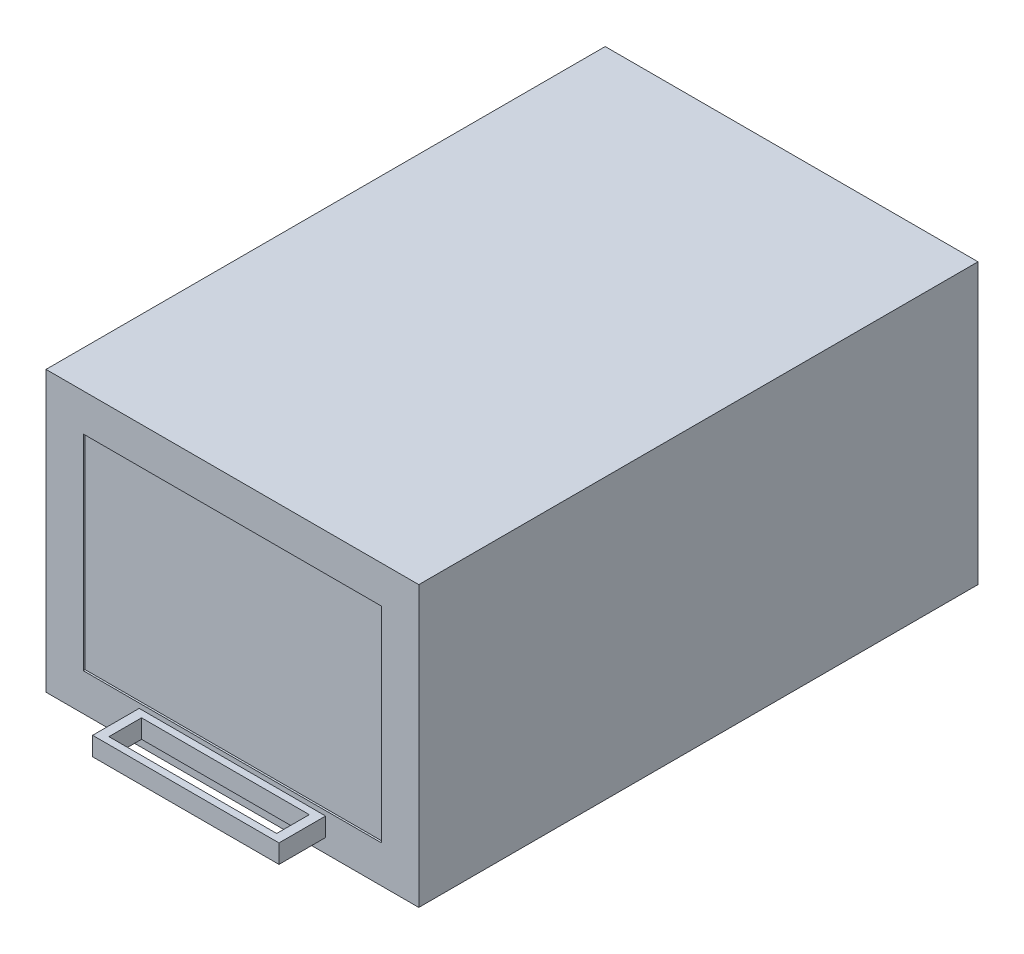
ISO-10303-21;
HEADER;
FILE_DESCRIPTION(('STEP AP214'),'2;1');
FILE_NAME('part.step','',(''),(''),'','','');
FILE_SCHEMA(('AUTOMOTIVE_DESIGN { 1 0 10303 214 1 1 1 1 }'));
ENDSEC;
DATA;
#1=APPLICATION_CONTEXT('core data for automotive mechanical design processes');
#2=APPLICATION_PROTOCOL_DEFINITION('international standard','automotive_design',2000,#1);
#3=PRODUCT_CONTEXT('',#1,'mechanical');
#4=PRODUCT('Part','Part','',(#3));
#5=PRODUCT_RELATED_PRODUCT_CATEGORY('part','',(#4));
#6=PRODUCT_DEFINITION_FORMATION('','',#4);
#7=PRODUCT_DEFINITION_CONTEXT('part definition',#1,'design');
#8=PRODUCT_DEFINITION('design','',#6,#7);
#9=PRODUCT_DEFINITION_SHAPE('','',#8);
#10=(LENGTH_UNIT() NAMED_UNIT(*) SI_UNIT(.MILLI.,.METRE.));
#11=(NAMED_UNIT(*) PLANE_ANGLE_UNIT() SI_UNIT($,.RADIAN.));
#12=(NAMED_UNIT(*) SI_UNIT($,.STERADIAN.) SOLID_ANGLE_UNIT());
#13=UNCERTAINTY_MEASURE_WITH_UNIT(LENGTH_MEASURE(1.E-05),#10,'distance_accuracy_value','');
#14=(GEOMETRIC_REPRESENTATION_CONTEXT(3) GLOBAL_UNCERTAINTY_ASSIGNED_CONTEXT((#13)) GLOBAL_UNIT_ASSIGNED_CONTEXT((#10,
#11,#12)) REPRESENTATION_CONTEXT('',''));
#15=CARTESIAN_POINT('',(0.,0.,0.));
#16=DIRECTION('',(0.,0.,1.));
#17=DIRECTION('',(1.,0.,0.));
#18=AXIS2_PLACEMENT_3D('',#15,#16,#17);
#19=CARTESIAN_POINT('',(0.,300.,600.));
#20=DIRECTION('',(0.,0.,-1.));
#21=DIRECTION('',(-1.,0.,0.));
#22=AXIS2_PLACEMENT_3D('',#19,#20,#21);
#23=PLANE('',#22);
#24=DIRECTION('',(1.,0.,0.));
#25=VECTOR('',#24,1.);
#26=CARTESIAN_POINT('',(-360.,40.,600.));
#27=LINE('',#26,#25);
#28=CARTESIAN_POINT('',(-360.,40.,600.));
#29=VERTEX_POINT('',#28);
#30=CARTESIAN_POINT('',(-40.0000000000001,40.,600.));
#31=VERTEX_POINT('',#30);
#32=EDGE_CURVE('E191',#29,#31,#27,.T.);
#33=ORIENTED_EDGE('',*,*,#32,.F.);
#34=DIRECTION('',(0.,-1.,0.));
#35=VECTOR('',#34,1.);
#36=CARTESIAN_POINT('',(-360.,260.,600.));
#37=LINE('',#36,#35);
#38=CARTESIAN_POINT('',(-360.,260.,600.));
#39=VERTEX_POINT('',#38);
#40=EDGE_CURVE('E57',#39,#29,#37,.T.);
#41=ORIENTED_EDGE('',*,*,#40,.F.);
#42=DIRECTION('',(-1.,0.,0.));
#43=VECTOR('',#42,1.);
#44=CARTESIAN_POINT('',(-360.,260.,600.));
#45=LINE('',#44,#43);
#46=CARTESIAN_POINT('',(-40.0000000000001,260.,600.));
#47=VERTEX_POINT('',#46);
#48=EDGE_CURVE('E178',#47,#39,#45,.T.);
#49=ORIENTED_EDGE('',*,*,#48,.F.);
#50=DIRECTION('',(0.,1.,0.));
#51=VECTOR('',#50,1.);
#52=CARTESIAN_POINT('',(-40.0000000000001,260.,600.));
#53=LINE('',#52,#51);
#54=EDGE_CURVE('E182',#31,#47,#53,.T.);
#55=ORIENTED_EDGE('',*,*,#54,.F.);
#56=EDGE_LOOP('',(#33,#41,#49,#55));
#57=FACE_BOUND('',#56,.T.);
#58=DIRECTION('',(1.,0.,0.));
#59=VECTOR('',#58,1.);
#60=CARTESIAN_POINT('',(0.,0.,600.));
#61=LINE('',#60,#59);
#62=CARTESIAN_POINT('',(-400.,0.,600.));
#63=VERTEX_POINT('',#62);
#64=CARTESIAN_POINT('',(0.,0.,600.));
#65=VERTEX_POINT('',#64);
#66=EDGE_CURVE('E298',#63,#65,#61,.T.);
#67=ORIENTED_EDGE('',*,*,#66,.T.);
#68=DIRECTION('',(0.,-1.,0.));
#69=VECTOR('',#68,1.);
#70=CARTESIAN_POINT('',(0.,300.,600.));
#71=LINE('',#70,#69);
#72=CARTESIAN_POINT('',(0.,300.,600.));
#73=VERTEX_POINT('',#72);
#74=EDGE_CURVE('E307',#73,#65,#71,.T.);
#75=ORIENTED_EDGE('',*,*,#74,.F.);
#76=DIRECTION('',(1.,0.,0.));
#77=VECTOR('',#76,1.);
#78=CARTESIAN_POINT('',(0.,300.,600.));
#79=LINE('',#78,#77);
#80=CARTESIAN_POINT('',(-400.,300.,600.));
#81=VERTEX_POINT('',#80);
#82=EDGE_CURVE('E304',#81,#73,#79,.T.);
#83=ORIENTED_EDGE('',*,*,#82,.F.);
#84=DIRECTION('',(0.,-1.,0.));
#85=VECTOR('',#84,1.);
#86=CARTESIAN_POINT('',(-400.,300.,600.));
#87=LINE('',#86,#85);
#88=EDGE_CURVE('E322',#81,#63,#87,.T.);
#89=ORIENTED_EDGE('',*,*,#88,.T.);
#90=EDGE_LOOP('',(#67,#75,#83,#89));
#91=FACE_BOUND('',#90,.T.);
#92=DIRECTION('',(0.,-1.,0.));
#93=VECTOR('',#92,1.);
#94=CARTESIAN_POINT('',(-300.,35.,600.));
#95=LINE('',#94,#93);
#96=CARTESIAN_POINT('',(-300.,35.,600.));
#97=VERTEX_POINT('',#96);
#98=CARTESIAN_POINT('',(-300.,15.,600.));
#99=VERTEX_POINT('',#98);
#100=EDGE_CURVE('E247',#97,#99,#95,.T.);
#101=ORIENTED_EDGE('',*,*,#100,.F.);
#102=DIRECTION('',(-1.,0.,0.));
#103=VECTOR('',#102,1.);
#104=CARTESIAN_POINT('',(-300.,35.,600.));
#105=LINE('',#104,#103);
#106=CARTESIAN_POINT('',(-99.9999999999999,35.,600.));
#107=VERTEX_POINT('',#106);
#108=EDGE_CURVE('E253',#107,#97,#105,.T.);
#109=ORIENTED_EDGE('',*,*,#108,.F.);
#110=DIRECTION('',(0.,1.,0.));
#111=VECTOR('',#110,1.);
#112=CARTESIAN_POINT('',(-99.9999999999999,35.,600.));
#113=LINE('',#112,#111);
#114=CARTESIAN_POINT('',(-99.9999999999999,15.,600.));
#115=VERTEX_POINT('',#114);
#116=EDGE_CURVE('E270',#115,#107,#113,.T.);
#117=ORIENTED_EDGE('',*,*,#116,.F.);
#118=DIRECTION('',(1.,0.,0.));
#119=VECTOR('',#118,1.);
#120=CARTESIAN_POINT('',(-300.,15.,600.));
#121=LINE('',#120,#119);
#122=EDGE_CURVE('E266',#99,#115,#121,.T.);
#123=ORIENTED_EDGE('',*,*,#122,.F.);
#124=EDGE_LOOP('',(#101,#109,#117,#123));
#125=FACE_BOUND('',#124,.T.);
#126=ADVANCED_FACE('F41',(#57,#91,#125),#23,.F.);
#127=CARTESIAN_POINT('',(0.,300.,0.));
#128=DIRECTION('',(-1.,0.,0.));
#129=DIRECTION('',(0.,0.,1.));
#130=AXIS2_PLACEMENT_3D('',#127,#128,#129);
#131=PLANE('',#130);
#132=DIRECTION('',(0.,0.,-1.));
#133=VECTOR('',#132,1.);
#134=CARTESIAN_POINT('',(0.,0.,0.));
#135=LINE('',#134,#133);
#136=CARTESIAN_POINT('',(0.,0.,0.));
#137=VERTEX_POINT('',#136);
#138=EDGE_CURVE('E292',#65,#137,#135,.T.);
#139=ORIENTED_EDGE('',*,*,#138,.T.);
#140=DIRECTION('',(0.,-1.,0.));
#141=VECTOR('',#140,1.);
#142=CARTESIAN_POINT('',(0.,300.,0.));
#143=LINE('',#142,#141);
#144=CARTESIAN_POINT('',(0.,300.,0.));
#145=VERTEX_POINT('',#144);
#146=EDGE_CURVE('E11',#145,#137,#143,.T.);
#147=ORIENTED_EDGE('',*,*,#146,.F.);
#148=DIRECTION('',(0.,0.,-1.));
#149=VECTOR('',#148,1.);
#150=CARTESIAN_POINT('',(0.,300.,0.));
#151=LINE('',#150,#149);
#152=EDGE_CURVE('E293',#73,#145,#151,.T.);
#153=ORIENTED_EDGE('',*,*,#152,.F.);
#154=ORIENTED_EDGE('',*,*,#74,.T.);
#155=EDGE_LOOP('',(#139,#147,#153,#154));
#156=FACE_BOUND('',#155,.T.);
#157=ADVANCED_FACE('F43',(#156),#131,.F.);
#158=CARTESIAN_POINT('',(0.,300.,0.));
#159=DIRECTION('',(0.,0.,1.));
#160=DIRECTION('',(1.,0.,0.));
#161=AXIS2_PLACEMENT_3D('',#158,#159,#160);
#162=PLANE('',#161);
#163=DIRECTION('',(-1.,0.,0.));
#164=VECTOR('',#163,1.);
#165=CARTESIAN_POINT('',(0.,0.,0.));
#166=LINE('',#165,#164);
#167=CARTESIAN_POINT('',(-400.,0.,0.));
#168=VERTEX_POINT('',#167);
#169=EDGE_CURVE('E311',#137,#168,#166,.T.);
#170=ORIENTED_EDGE('',*,*,#169,.T.);
#171=DIRECTION('',(0.,-1.,0.));
#172=VECTOR('',#171,1.);
#173=CARTESIAN_POINT('',(-400.,300.,0.));
#174=LINE('',#173,#172);
#175=CARTESIAN_POINT('',(-400.,300.,0.));
#176=VERTEX_POINT('',#175);
#177=EDGE_CURVE('E50',#176,#168,#174,.T.);
#178=ORIENTED_EDGE('',*,*,#177,.F.);
#179=DIRECTION('',(-1.,0.,0.));
#180=VECTOR('',#179,1.);
#181=CARTESIAN_POINT('',(0.,300.,0.));
#182=LINE('',#181,#180);
#183=EDGE_CURVE('E297',#145,#176,#182,.T.);
#184=ORIENTED_EDGE('',*,*,#183,.F.);
#185=ORIENTED_EDGE('',*,*,#146,.T.);
#186=EDGE_LOOP('',(#170,#178,#184,#185));
#187=FACE_BOUND('',#186,.T.);
#188=ADVANCED_FACE('F347',(#187),#162,.F.);
#189=CARTESIAN_POINT('',(-400.,300.,0.));
#190=DIRECTION('',(1.,0.,0.));
#191=DIRECTION('',(0.,0.,-1.));
#192=AXIS2_PLACEMENT_3D('',#189,#190,#191);
#193=PLANE('',#192);
#194=DIRECTION('',(0.,0.,1.));
#195=VECTOR('',#194,1.);
#196=CARTESIAN_POINT('',(-400.,0.,0.));
#197=LINE('',#196,#195);
#198=EDGE_CURVE('E314',#168,#63,#197,.T.);
#199=ORIENTED_EDGE('',*,*,#198,.T.);
#200=ORIENTED_EDGE('',*,*,#88,.F.);
#201=DIRECTION('',(0.,0.,1.));
#202=VECTOR('',#201,1.);
#203=CARTESIAN_POINT('',(-400.,300.,0.));
#204=LINE('',#203,#202);
#205=EDGE_CURVE('E301',#176,#81,#204,.T.);
#206=ORIENTED_EDGE('',*,*,#205,.F.);
#207=ORIENTED_EDGE('',*,*,#177,.T.);
#208=EDGE_LOOP('',(#199,#200,#206,#207));
#209=FACE_BOUND('',#208,.T.);
#210=ADVANCED_FACE('F331',(#209),#193,.F.);
#211=CARTESIAN_POINT('',(0.,300.,0.));
#212=DIRECTION('',(0.,-1.,0.));
#213=DIRECTION('',(0.,0.,-1.));
#214=AXIS2_PLACEMENT_3D('',#211,#212,#213);
#215=PLANE('',#214);
#216=ORIENTED_EDGE('',*,*,#152,.T.);
#217=ORIENTED_EDGE('',*,*,#183,.T.);
#218=ORIENTED_EDGE('',*,*,#205,.T.);
#219=ORIENTED_EDGE('',*,*,#82,.T.);
#220=EDGE_LOOP('',(#216,#217,#218,#219));
#221=FACE_BOUND('',#220,.T.);
#222=ADVANCED_FACE('F346',(#221),#215,.F.);
#223=CARTESIAN_POINT('',(0.,0.,0.));
#224=DIRECTION('',(0.,-1.,0.));
#225=DIRECTION('',(0.,0.,-1.));
#226=AXIS2_PLACEMENT_3D('',#223,#224,#225);
#227=PLANE('',#226);
#228=ORIENTED_EDGE('',*,*,#138,.F.);
#229=ORIENTED_EDGE('',*,*,#66,.F.);
#230=ORIENTED_EDGE('',*,*,#198,.F.);
#231=ORIENTED_EDGE('',*,*,#169,.F.);
#232=EDGE_LOOP('',(#228,#229,#230,#231));
#233=FACE_BOUND('',#232,.T.);
#234=ADVANCED_FACE('F337',(#233),#227,.T.);
#235=CARTESIAN_POINT('',(-300.,35.,650.));
#236=DIRECTION('',(1.,0.,0.));
#237=DIRECTION('',(0.,0.,-1.));
#238=AXIS2_PLACEMENT_3D('',#235,#236,#237);
#239=PLANE('',#238);
#240=ORIENTED_EDGE('',*,*,#100,.T.);
#241=DIRECTION('',(0.,0.,-1.));
#242=VECTOR('',#241,1.);
#243=CARTESIAN_POINT('',(-300.,15.,650.));
#244=LINE('',#243,#242);
#245=CARTESIAN_POINT('',(-300.,15.,650.));
#246=VERTEX_POINT('',#245);
#247=EDGE_CURVE('E288',#246,#99,#244,.T.);
#248=ORIENTED_EDGE('',*,*,#247,.F.);
#249=DIRECTION('',(0.,-1.,0.));
#250=VECTOR('',#249,1.);
#251=CARTESIAN_POINT('',(-300.,35.,650.));
#252=LINE('',#251,#250);
#253=CARTESIAN_POINT('',(-300.,35.,650.));
#254=VERTEX_POINT('',#253);
#255=EDGE_CURVE('E248',#254,#246,#252,.T.);
#256=ORIENTED_EDGE('',*,*,#255,.F.);
#257=DIRECTION('',(0.,0.,-1.));
#258=VECTOR('',#257,1.);
#259=CARTESIAN_POINT('',(-300.,35.,650.));
#260=LINE('',#259,#258);
#261=EDGE_CURVE('E262',#254,#97,#260,.T.);
#262=ORIENTED_EDGE('',*,*,#261,.T.);
#263=EDGE_LOOP('',(#240,#248,#256,#262));
#264=FACE_BOUND('',#263,.T.);
#265=ADVANCED_FACE('F362',(#264),#239,.F.);
#266=CARTESIAN_POINT('',(-300.,15.,650.));
#267=DIRECTION('',(0.,1.,0.));
#268=DIRECTION('',(0.,0.,1.));
#269=AXIS2_PLACEMENT_3D('',#266,#267,#268);
#270=PLANE('',#269);
#271=DIRECTION('',(-1.,0.,0.));
#272=VECTOR('',#271,1.);
#273=CARTESIAN_POINT('',(-300.,15.,607.5));
#274=LINE('',#273,#272);
#275=CARTESIAN_POINT('',(-110.,15.,607.5));
#276=VERTEX_POINT('',#275);
#277=CARTESIAN_POINT('',(-290.,15.,607.5));
#278=VERTEX_POINT('',#277);
#279=EDGE_CURVE('E239',#276,#278,#274,.T.);
#280=ORIENTED_EDGE('',*,*,#279,.T.);
#281=DIRECTION('',(0.,0.,1.));
#282=VECTOR('',#281,1.);
#283=CARTESIAN_POINT('',(-290.,15.,650.));
#284=LINE('',#283,#282);
#285=CARTESIAN_POINT('',(-290.,15.,642.5));
#286=VERTEX_POINT('',#285);
#287=EDGE_CURVE('E243',#278,#286,#284,.T.);
#288=ORIENTED_EDGE('',*,*,#287,.T.);
#289=DIRECTION('',(1.,0.,0.));
#290=VECTOR('',#289,1.);
#291=CARTESIAN_POINT('',(-300.,15.,642.5));
#292=LINE('',#291,#290);
#293=CARTESIAN_POINT('',(-110.,15.,642.5));
#294=VERTEX_POINT('',#293);
#295=EDGE_CURVE('E223',#286,#294,#292,.T.);
#296=ORIENTED_EDGE('',*,*,#295,.T.);
#297=DIRECTION('',(0.,0.,-1.));
#298=VECTOR('',#297,1.);
#299=CARTESIAN_POINT('',(-110.,15.,650.));
#300=LINE('',#299,#298);
#301=EDGE_CURVE('E235',#294,#276,#300,.T.);
#302=ORIENTED_EDGE('',*,*,#301,.T.);
#303=EDGE_LOOP('',(#280,#288,#296,#302));
#304=FACE_BOUND('',#303,.T.);
#305=ORIENTED_EDGE('',*,*,#122,.T.);
#306=DIRECTION('',(0.,0.,-1.));
#307=VECTOR('',#306,1.);
#308=CARTESIAN_POINT('',(-99.9999999999999,15.,650.));
#309=LINE('',#308,#307);
#310=CARTESIAN_POINT('',(-99.9999999999999,15.,650.));
#311=VERTEX_POINT('',#310);
#312=EDGE_CURVE('E284',#311,#115,#309,.T.);
#313=ORIENTED_EDGE('',*,*,#312,.F.);
#314=DIRECTION('',(1.,0.,0.));
#315=VECTOR('',#314,1.);
#316=CARTESIAN_POINT('',(-300.,15.,650.));
#317=LINE('',#316,#315);
#318=EDGE_CURVE('E252',#246,#311,#317,.T.);
#319=ORIENTED_EDGE('',*,*,#318,.F.);
#320=ORIENTED_EDGE('',*,*,#247,.T.);
#321=EDGE_LOOP('',(#305,#313,#319,#320));
#322=FACE_BOUND('',#321,.T.);
#323=ADVANCED_FACE('F367',(#304,#322),#270,.F.);
#324=CARTESIAN_POINT('',(-99.9999999999999,35.,650.));
#325=DIRECTION('',(-1.,0.,0.));
#326=DIRECTION('',(0.,0.,1.));
#327=AXIS2_PLACEMENT_3D('',#324,#325,#326);
#328=PLANE('',#327);
#329=ORIENTED_EDGE('',*,*,#116,.T.);
#330=DIRECTION('',(0.,0.,-1.));
#331=VECTOR('',#330,1.);
#332=CARTESIAN_POINT('',(-99.9999999999999,35.,650.));
#333=LINE('',#332,#331);
#334=CARTESIAN_POINT('',(-99.9999999999999,35.,650.));
#335=VERTEX_POINT('',#334);
#336=EDGE_CURVE('E280',#335,#107,#333,.T.);
#337=ORIENTED_EDGE('',*,*,#336,.F.);
#338=DIRECTION('',(0.,1.,0.));
#339=VECTOR('',#338,1.);
#340=CARTESIAN_POINT('',(-99.9999999999999,35.,650.));
#341=LINE('',#340,#339);
#342=EDGE_CURVE('E256',#311,#335,#341,.T.);
#343=ORIENTED_EDGE('',*,*,#342,.F.);
#344=ORIENTED_EDGE('',*,*,#312,.T.);
#345=EDGE_LOOP('',(#329,#337,#343,#344));
#346=FACE_BOUND('',#345,.T.);
#347=ADVANCED_FACE('F371',(#346),#328,.F.);
#348=CARTESIAN_POINT('',(-300.,35.,650.));
#349=DIRECTION('',(0.,-1.,0.));
#350=DIRECTION('',(0.,0.,-1.));
#351=AXIS2_PLACEMENT_3D('',#348,#349,#350);
#352=PLANE('',#351);
#353=DIRECTION('',(1.,0.,0.));
#354=VECTOR('',#353,1.);
#355=CARTESIAN_POINT('',(-290.,35.,642.5));
#356=LINE('',#355,#354);
#357=CARTESIAN_POINT('',(-290.,35.,642.5));
#358=VERTEX_POINT('',#357);
#359=CARTESIAN_POINT('',(-110.,35.,642.5));
#360=VERTEX_POINT('',#359);
#361=EDGE_CURVE('E208',#358,#360,#356,.T.);
#362=ORIENTED_EDGE('',*,*,#361,.F.);
#363=DIRECTION('',(0.,0.,1.));
#364=VECTOR('',#363,1.);
#365=CARTESIAN_POINT('',(-290.,35.,607.5));
#366=LINE('',#365,#364);
#367=CARTESIAN_POINT('',(-290.,35.,607.5));
#368=VERTEX_POINT('',#367);
#369=EDGE_CURVE('E200',#368,#358,#366,.T.);
#370=ORIENTED_EDGE('',*,*,#369,.F.);
#371=DIRECTION('',(-1.,0.,0.));
#372=VECTOR('',#371,1.);
#373=CARTESIAN_POINT('',(-290.,35.,607.5));
#374=LINE('',#373,#372);
#375=CARTESIAN_POINT('',(-110.,35.,607.5));
#376=VERTEX_POINT('',#375);
#377=EDGE_CURVE('E215',#376,#368,#374,.T.);
#378=ORIENTED_EDGE('',*,*,#377,.F.);
#379=DIRECTION('',(0.,0.,-1.));
#380=VECTOR('',#379,1.);
#381=CARTESIAN_POINT('',(-110.,35.,607.5));
#382=LINE('',#381,#380);
#383=EDGE_CURVE('E211',#360,#376,#382,.T.);
#384=ORIENTED_EDGE('',*,*,#383,.F.);
#385=EDGE_LOOP('',(#362,#370,#378,#384));
#386=FACE_BOUND('',#385,.T.);
#387=ORIENTED_EDGE('',*,*,#108,.T.);
#388=ORIENTED_EDGE('',*,*,#261,.F.);
#389=DIRECTION('',(-1.,0.,0.));
#390=VECTOR('',#389,1.);
#391=CARTESIAN_POINT('',(-300.,35.,650.));
#392=LINE('',#391,#390);
#393=EDGE_CURVE('E259',#335,#254,#392,.T.);
#394=ORIENTED_EDGE('',*,*,#393,.F.);
#395=ORIENTED_EDGE('',*,*,#336,.T.);
#396=EDGE_LOOP('',(#387,#388,#394,#395));
#397=FACE_BOUND('',#396,.T.);
#398=ADVANCED_FACE('F375',(#386,#397),#352,.F.);
#399=CARTESIAN_POINT('',(0.,0.,650.));
#400=DIRECTION('',(0.,0.,1.));
#401=DIRECTION('',(1.,0.,0.));
#402=AXIS2_PLACEMENT_3D('',#399,#400,#401);
#403=PLANE('',#402);
#404=ORIENTED_EDGE('',*,*,#255,.T.);
#405=ORIENTED_EDGE('',*,*,#318,.T.);
#406=ORIENTED_EDGE('',*,*,#342,.T.);
#407=ORIENTED_EDGE('',*,*,#393,.T.);
#408=EDGE_LOOP('',(#404,#405,#406,#407));
#409=FACE_BOUND('',#408,.T.);
#410=ADVANCED_FACE('F379',(#409),#403,.T.);
#411=CARTESIAN_POINT('',(-290.,-15.,607.5));
#412=DIRECTION('',(-1.,0.,0.));
#413=DIRECTION('',(0.,0.,1.));
#414=AXIS2_PLACEMENT_3D('',#411,#412,#413);
#415=PLANE('',#414);
#416=DIRECTION('',(0.,1.,0.));
#417=VECTOR('',#416,1.);
#418=CARTESIAN_POINT('',(-290.,-15.,607.5));
#419=LINE('',#418,#417);
#420=EDGE_CURVE('E220',#278,#368,#419,.T.);
#421=ORIENTED_EDGE('',*,*,#420,.T.);
#422=ORIENTED_EDGE('',*,*,#369,.T.);
#423=DIRECTION('',(0.,1.,0.));
#424=VECTOR('',#423,1.);
#425=CARTESIAN_POINT('',(-290.,-15.,642.5));
#426=LINE('',#425,#424);
#427=EDGE_CURVE('E219',#286,#358,#426,.T.);
#428=ORIENTED_EDGE('',*,*,#427,.F.);
#429=ORIENTED_EDGE('',*,*,#287,.F.);
#430=EDGE_LOOP('',(#421,#422,#428,#429));
#431=FACE_BOUND('',#430,.T.);
#432=ADVANCED_FACE('F383',(#431),#415,.F.);
#433=CARTESIAN_POINT('',(-290.,-15.,607.5));
#434=DIRECTION('',(0.,0.,-1.));
#435=DIRECTION('',(-1.,0.,0.));
#436=AXIS2_PLACEMENT_3D('',#433,#434,#435);
#437=PLANE('',#436);
#438=DIRECTION('',(0.,1.,0.));
#439=VECTOR('',#438,1.);
#440=CARTESIAN_POINT('',(-110.,-15.,607.5));
#441=LINE('',#440,#439);
#442=EDGE_CURVE('E224',#276,#376,#441,.T.);
#443=ORIENTED_EDGE('',*,*,#442,.T.);
#444=ORIENTED_EDGE('',*,*,#377,.T.);
#445=ORIENTED_EDGE('',*,*,#420,.F.);
#446=ORIENTED_EDGE('',*,*,#279,.F.);
#447=EDGE_LOOP('',(#443,#444,#445,#446));
#448=FACE_BOUND('',#447,.T.);
#449=ADVANCED_FACE('F387',(#448),#437,.F.);
#450=CARTESIAN_POINT('',(-110.,-15.,607.5));
#451=DIRECTION('',(1.,0.,0.));
#452=DIRECTION('',(0.,0.,-1.));
#453=AXIS2_PLACEMENT_3D('',#450,#451,#452);
#454=PLANE('',#453);
#455=DIRECTION('',(0.,1.,0.));
#456=VECTOR('',#455,1.);
#457=CARTESIAN_POINT('',(-110.,-15.,642.5));
#458=LINE('',#457,#456);
#459=EDGE_CURVE('E65',#294,#360,#458,.T.);
#460=ORIENTED_EDGE('',*,*,#459,.T.);
#461=ORIENTED_EDGE('',*,*,#383,.T.);
#462=ORIENTED_EDGE('',*,*,#442,.F.);
#463=ORIENTED_EDGE('',*,*,#301,.F.);
#464=EDGE_LOOP('',(#460,#461,#462,#463));
#465=FACE_BOUND('',#464,.T.);
#466=ADVANCED_FACE('F392',(#465),#454,.F.);
#467=CARTESIAN_POINT('',(-290.,-15.,642.5));
#468=DIRECTION('',(0.,0.,1.));
#469=DIRECTION('',(1.,0.,0.));
#470=AXIS2_PLACEMENT_3D('',#467,#468,#469);
#471=PLANE('',#470);
#472=ORIENTED_EDGE('',*,*,#427,.T.);
#473=ORIENTED_EDGE('',*,*,#361,.T.);
#474=ORIENTED_EDGE('',*,*,#459,.F.);
#475=ORIENTED_EDGE('',*,*,#295,.F.);
#476=EDGE_LOOP('',(#472,#473,#474,#475));
#477=FACE_BOUND('',#476,.T.);
#478=ADVANCED_FACE('F389',(#477),#471,.F.);
#479=CARTESIAN_POINT('',(-360.,260.,598.));
#480=DIRECTION('',(-1.,0.,0.));
#481=DIRECTION('',(0.,0.,1.));
#482=AXIS2_PLACEMENT_3D('',#479,#480,#481);
#483=PLANE('',#482);
#484=ORIENTED_EDGE('',*,*,#40,.T.);
#485=DIRECTION('',(0.,0.,1.));
#486=VECTOR('',#485,1.);
#487=CARTESIAN_POINT('',(-360.,40.,598.));
#488=LINE('',#487,#486);
#489=CARTESIAN_POINT('',(-360.,40.,598.));
#490=VERTEX_POINT('',#489);
#491=EDGE_CURVE('E153',#490,#29,#488,.T.);
#492=ORIENTED_EDGE('',*,*,#491,.F.);
#493=DIRECTION('',(0.,-1.,0.));
#494=VECTOR('',#493,1.);
#495=CARTESIAN_POINT('',(-360.,260.,598.));
#496=LINE('',#495,#494);
#497=CARTESIAN_POINT('',(-360.,260.,598.));
#498=VERTEX_POINT('',#497);
#499=EDGE_CURVE('E157',#498,#490,#496,.T.);
#500=ORIENTED_EDGE('',*,*,#499,.F.);
#501=DIRECTION('',(0.,0.,1.));
#502=VECTOR('',#501,1.);
#503=CARTESIAN_POINT('',(-360.,260.,598.));
#504=LINE('',#503,#502);
#505=EDGE_CURVE('E197',#498,#39,#504,.T.);
#506=ORIENTED_EDGE('',*,*,#505,.T.);
#507=EDGE_LOOP('',(#484,#492,#500,#506));
#508=FACE_BOUND('',#507,.T.);
#509=ADVANCED_FACE('F155',(#508),#483,.F.);
#510=CARTESIAN_POINT('',(-360.,260.,598.));
#511=DIRECTION('',(0.,1.,0.));
#512=DIRECTION('',(0.,0.,1.));
#513=AXIS2_PLACEMENT_3D('',#510,#511,#512);
#514=PLANE('',#513);
#515=ORIENTED_EDGE('',*,*,#48,.T.);
#516=ORIENTED_EDGE('',*,*,#505,.F.);
#517=DIRECTION('',(-1.,0.,0.));
#518=VECTOR('',#517,1.);
#519=CARTESIAN_POINT('',(-360.,260.,598.));
#520=LINE('',#519,#518);
#521=CARTESIAN_POINT('',(-40.0000000000001,260.,598.));
#522=VERTEX_POINT('',#521);
#523=EDGE_CURVE('E164',#522,#498,#520,.T.);
#524=ORIENTED_EDGE('',*,*,#523,.F.);
#525=DIRECTION('',(0.,0.,1.));
#526=VECTOR('',#525,1.);
#527=CARTESIAN_POINT('',(-40.0000000000001,260.,598.));
#528=LINE('',#527,#526);
#529=EDGE_CURVE('E201',#522,#47,#528,.T.);
#530=ORIENTED_EDGE('',*,*,#529,.T.);
#531=EDGE_LOOP('',(#515,#516,#524,#530));
#532=FACE_BOUND('',#531,.T.);
#533=ADVANCED_FACE('F401',(#532),#514,.F.);
#534=CARTESIAN_POINT('',(-40.0000000000001,260.,598.));
#535=DIRECTION('',(1.,0.,0.));
#536=DIRECTION('',(0.,0.,-1.));
#537=AXIS2_PLACEMENT_3D('',#534,#535,#536);
#538=PLANE('',#537);
#539=ORIENTED_EDGE('',*,*,#54,.T.);
#540=ORIENTED_EDGE('',*,*,#529,.F.);
#541=DIRECTION('',(0.,1.,0.));
#542=VECTOR('',#541,1.);
#543=CARTESIAN_POINT('',(-40.0000000000001,260.,598.));
#544=LINE('',#543,#542);
#545=CARTESIAN_POINT('',(-40.0000000000001,40.,598.));
#546=VERTEX_POINT('',#545);
#547=EDGE_CURVE('E173',#546,#522,#544,.T.);
#548=ORIENTED_EDGE('',*,*,#547,.F.);
#549=DIRECTION('',(0.,0.,1.));
#550=VECTOR('',#549,1.);
#551=CARTESIAN_POINT('',(-40.0000000000001,40.,598.));
#552=LINE('',#551,#550);
#553=EDGE_CURVE('E163',#546,#31,#552,.T.);
#554=ORIENTED_EDGE('',*,*,#553,.T.);
#555=EDGE_LOOP('',(#539,#540,#548,#554));
#556=FACE_BOUND('',#555,.T.);
#557=ADVANCED_FACE('F404',(#556),#538,.F.);
#558=CARTESIAN_POINT('',(-360.,40.,598.));
#559=DIRECTION('',(0.,-1.,0.));
#560=DIRECTION('',(0.,0.,-1.));
#561=AXIS2_PLACEMENT_3D('',#558,#559,#560);
#562=PLANE('',#561);
#563=ORIENTED_EDGE('',*,*,#32,.T.);
#564=ORIENTED_EDGE('',*,*,#553,.F.);
#565=DIRECTION('',(1.,0.,0.));
#566=VECTOR('',#565,1.);
#567=CARTESIAN_POINT('',(-360.,40.,598.));
#568=LINE('',#567,#566);
#569=EDGE_CURVE('E167',#490,#546,#568,.T.);
#570=ORIENTED_EDGE('',*,*,#569,.F.);
#571=ORIENTED_EDGE('',*,*,#491,.T.);
#572=EDGE_LOOP('',(#563,#564,#570,#571));
#573=FACE_BOUND('',#572,.T.);
#574=ADVANCED_FACE('F168',(#573),#562,.F.);
#575=CARTESIAN_POINT('',(0.,0.,598.));
#576=DIRECTION('',(0.,0.,1.));
#577=DIRECTION('',(1.,0.,0.));
#578=AXIS2_PLACEMENT_3D('',#575,#576,#577);
#579=PLANE('',#578);
#580=ORIENTED_EDGE('',*,*,#499,.T.);
#581=ORIENTED_EDGE('',*,*,#569,.T.);
#582=ORIENTED_EDGE('',*,*,#547,.T.);
#583=ORIENTED_EDGE('',*,*,#523,.T.);
#584=EDGE_LOOP('',(#580,#581,#582,#583));
#585=FACE_BOUND('',#584,.T.);
#586=ADVANCED_FACE('F175',(#585),#579,.T.);
#587=CLOSED_SHELL('',(#126,#157,#188,#210,#222,#234,#265,#323,#347,#398,#410,#432,#449,#466,
#478,#509,#533,#557,#574,#586));
#588=MANIFOLD_SOLID_BREP('B2',#587);
#589=ADVANCED_BREP_SHAPE_REPRESENTATION('',(#18,#588),#14);
#590=SHAPE_DEFINITION_REPRESENTATION(#9,#589);
ENDSEC;
END-ISO-10303-21;
